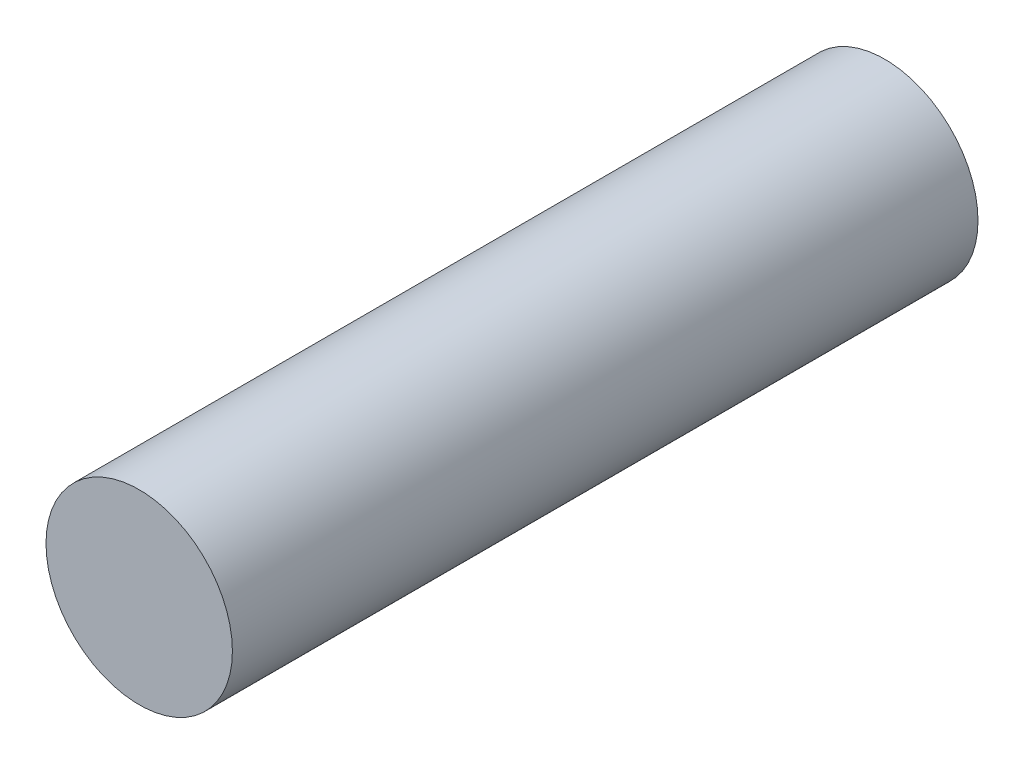
ISO-10303-21;
HEADER;
FILE_DESCRIPTION(('STEP AP214'),'2;1');
FILE_NAME('part.step','',(''),(''),'','','');
FILE_SCHEMA(('AUTOMOTIVE_DESIGN { 1 0 10303 214 1 1 1 1 }'));
ENDSEC;
DATA;
#1=APPLICATION_CONTEXT('core data for automotive mechanical design processes');
#2=APPLICATION_PROTOCOL_DEFINITION('international standard','automotive_design',2000,#1);
#3=PRODUCT_CONTEXT('',#1,'mechanical');
#4=PRODUCT('Part','Part','',(#3));
#5=PRODUCT_RELATED_PRODUCT_CATEGORY('part','',(#4));
#6=PRODUCT_DEFINITION_FORMATION('','',#4);
#7=PRODUCT_DEFINITION_CONTEXT('part definition',#1,'design');
#8=PRODUCT_DEFINITION('design','',#6,#7);
#9=PRODUCT_DEFINITION_SHAPE('','',#8);
#10=(LENGTH_UNIT() NAMED_UNIT(*) SI_UNIT(.MILLI.,.METRE.));
#11=(NAMED_UNIT(*) PLANE_ANGLE_UNIT() SI_UNIT($,.RADIAN.));
#12=(NAMED_UNIT(*) SI_UNIT($,.STERADIAN.) SOLID_ANGLE_UNIT());
#13=UNCERTAINTY_MEASURE_WITH_UNIT(LENGTH_MEASURE(1.E-05),#10,'distance_accuracy_value','');
#14=(GEOMETRIC_REPRESENTATION_CONTEXT(3) GLOBAL_UNCERTAINTY_ASSIGNED_CONTEXT((#13)) GLOBAL_UNIT_ASSIGNED_CONTEXT((#10,
#11,#12)) REPRESENTATION_CONTEXT('',''));
#15=CARTESIAN_POINT('',(0.,0.,0.));
#16=DIRECTION('',(0.,0.,1.));
#17=DIRECTION('',(1.,0.,0.));
#18=AXIS2_PLACEMENT_3D('',#15,#16,#17);
#19=CARTESIAN_POINT('',(0.,0.,32.));
#20=DIRECTION('',(0.,0.,-1.));
#21=DIRECTION('',(-1.,0.,0.));
#22=AXIS2_PLACEMENT_3D('',#19,#20,#21);
#23=CYLINDRICAL_SURFACE('',#22,4.);
#24=CARTESIAN_POINT('',(0.,0.,32.));
#25=DIRECTION('',(0.,0.,1.));
#26=DIRECTION('',(1.,0.,0.));
#27=AXIS2_PLACEMENT_3D('',#24,#25,#26);
#28=CIRCLE('',#27,4.);
#29=CARTESIAN_POINT('',(4.,0.,32.));
#30=VERTEX_POINT('',#29);
#31=EDGE_CURVE('E10',#30,#30,#28,.T.);
#32=ORIENTED_EDGE('',*,*,#31,.F.);
#33=EDGE_LOOP('',(#32));
#34=FACE_BOUND('',#33,.T.);
#35=CARTESIAN_POINT('',(0.,0.,0.));
#36=DIRECTION('',(0.,0.,1.));
#37=DIRECTION('',(1.,0.,0.));
#38=AXIS2_PLACEMENT_3D('',#35,#36,#37);
#39=CIRCLE('',#38,4.);
#40=CARTESIAN_POINT('',(4.,0.,0.));
#41=VERTEX_POINT('',#40);
#42=EDGE_CURVE('E34',#41,#41,#39,.T.);
#43=ORIENTED_EDGE('',*,*,#42,.T.);
#44=EDGE_LOOP('',(#43));
#45=FACE_BOUND('',#44,.T.);
#46=ADVANCED_FACE('F31',(#34,#45),#23,.T.);
#47=CARTESIAN_POINT('',(0.,0.,32.));
#48=DIRECTION('',(0.,0.,1.));
#49=DIRECTION('',(1.,0.,0.));
#50=AXIS2_PLACEMENT_3D('',#47,#48,#49);
#51=PLANE('',#50);
#52=ORIENTED_EDGE('',*,*,#31,.T.);
#53=EDGE_LOOP('',(#52));
#54=FACE_BOUND('',#53,.T.);
#55=ADVANCED_FACE('F46',(#54),#51,.T.);
#56=CARTESIAN_POINT('',(0.,0.,0.));
#57=DIRECTION('',(0.,0.,1.));
#58=DIRECTION('',(1.,0.,0.));
#59=AXIS2_PLACEMENT_3D('',#56,#57,#58);
#60=PLANE('',#59);
#61=ORIENTED_EDGE('',*,*,#42,.F.);
#62=EDGE_LOOP('',(#61));
#63=FACE_BOUND('',#62,.T.);
#64=ADVANCED_FACE('F44',(#63),#60,.F.);
#65=CLOSED_SHELL('',(#46,#55,#64));
#66=MANIFOLD_SOLID_BREP('B2',#65);
#67=ADVANCED_BREP_SHAPE_REPRESENTATION('',(#18,#66),#14);
#68=SHAPE_DEFINITION_REPRESENTATION(#9,#67);
ENDSEC;
END-ISO-10303-21;
